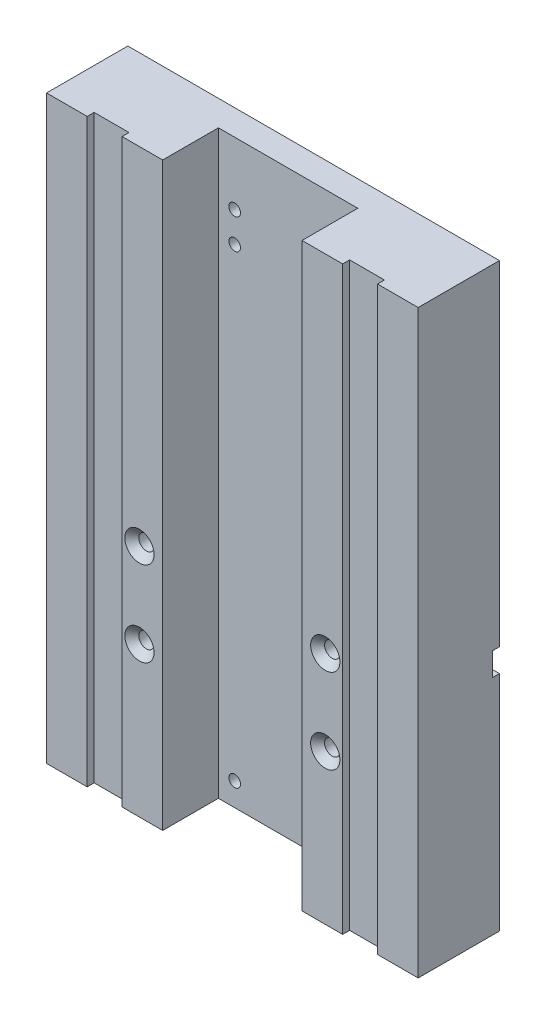
ISO-10303-21;
HEADER;
FILE_DESCRIPTION(('STEP AP214'),'2;1');
FILE_NAME('part.step','',(''),(''),'','','');
FILE_SCHEMA(('AUTOMOTIVE_DESIGN { 1 0 10303 214 1 1 1 1 }'));
ENDSEC;
DATA;
#1=APPLICATION_CONTEXT('core data for automotive mechanical design processes');
#2=APPLICATION_PROTOCOL_DEFINITION('international standard','automotive_design',2000,#1);
#3=PRODUCT_CONTEXT('',#1,'mechanical');
#4=PRODUCT('Part','Part','',(#3));
#5=PRODUCT_RELATED_PRODUCT_CATEGORY('part','',(#4));
#6=PRODUCT_DEFINITION_FORMATION('','',#4);
#7=PRODUCT_DEFINITION_CONTEXT('part definition',#1,'design');
#8=PRODUCT_DEFINITION('design','',#6,#7);
#9=PRODUCT_DEFINITION_SHAPE('','',#8);
#10=(LENGTH_UNIT() NAMED_UNIT(*) SI_UNIT(.MILLI.,.METRE.));
#11=(NAMED_UNIT(*) PLANE_ANGLE_UNIT() SI_UNIT($,.RADIAN.));
#12=(NAMED_UNIT(*) SI_UNIT($,.STERADIAN.) SOLID_ANGLE_UNIT());
#13=UNCERTAINTY_MEASURE_WITH_UNIT(LENGTH_MEASURE(1.E-05),#10,'distance_accuracy_value','');
#14=(GEOMETRIC_REPRESENTATION_CONTEXT(3) GLOBAL_UNCERTAINTY_ASSIGNED_CONTEXT((#13)) GLOBAL_UNIT_ASSIGNED_CONTEXT((#10,
#11,#12)) REPRESENTATION_CONTEXT('',''));
#15=CARTESIAN_POINT('',(0.,0.,0.));
#16=DIRECTION('',(0.,0.,1.));
#17=DIRECTION('',(1.,0.,0.));
#18=AXIS2_PLACEMENT_3D('',#15,#16,#17);
#19=CARTESIAN_POINT('',(0.,0.,0.));
#20=DIRECTION('',(0.,0.,-1.));
#21=DIRECTION('',(-1.,0.,0.));
#22=AXIS2_PLACEMENT_3D('',#19,#20,#21);
#23=PLANE('',#22);
#24=DIRECTION('',(1.,0.,0.));
#25=VECTOR('',#24,1.);
#26=CARTESIAN_POINT('',(80.,202.,0.));
#27=LINE('',#26,#25);
#28=CARTESIAN_POINT('',(62.5,202.,0.));
#29=VERTEX_POINT('',#28);
#30=CARTESIAN_POINT('',(80.,202.,0.));
#31=VERTEX_POINT('',#30);
#32=EDGE_CURVE('E338',#29,#31,#27,.T.);
#33=ORIENTED_EDGE('',*,*,#32,.F.);
#34=DIRECTION('',(0.,1.,0.));
#35=VECTOR('',#34,1.);
#36=CARTESIAN_POINT('',(62.5,252.,0.));
#37=LINE('',#36,#35);
#38=CARTESIAN_POINT('',(62.5,-48.,0.));
#39=VERTEX_POINT('',#38);
#40=EDGE_CURVE('E209',#39,#29,#37,.T.);
#41=ORIENTED_EDGE('',*,*,#40,.F.);
#42=DIRECTION('',(-1.,0.,0.));
#43=VECTOR('',#42,1.);
#44=CARTESIAN_POINT('',(80.,-48.,0.));
#45=LINE('',#44,#43);
#46=CARTESIAN_POINT('',(80.,-48.,0.));
#47=VERTEX_POINT('',#46);
#48=EDGE_CURVE('E331',#47,#39,#45,.T.);
#49=ORIENTED_EDGE('',*,*,#48,.F.);
#50=DIRECTION('',(0.,-1.,0.));
#51=VECTOR('',#50,1.);
#52=CARTESIAN_POINT('',(80.,202.,0.));
#53=LINE('',#52,#51);
#54=EDGE_CURVE('E308',#31,#47,#53,.T.);
#55=ORIENTED_EDGE('',*,*,#54,.F.);
#56=EDGE_LOOP('',(#33,#41,#49,#55));
#57=FACE_BOUND('',#56,.T.);
#58=ADVANCED_FACE('F38',(#57),#23,.F.);
#59=CARTESIAN_POINT('',(-62.5,-48.,0.));
#60=VERTEX_POINT('',#59);
#61=CARTESIAN_POINT('',(-80.,-48.,0.));
#62=VERTEX_POINT('',#61);
#63=EDGE_CURVE('E330',#60,#62,#45,.T.);
#64=ORIENTED_EDGE('',*,*,#63,.F.);
#65=DIRECTION('',(0.,1.,0.));
#66=VECTOR('',#65,1.);
#67=CARTESIAN_POINT('',(-62.5,0.,0.));
#68=LINE('',#67,#66);
#69=CARTESIAN_POINT('',(-62.5,202.,0.));
#70=VERTEX_POINT('',#69);
#71=EDGE_CURVE('E190',#60,#70,#68,.T.);
#72=ORIENTED_EDGE('',*,*,#71,.T.);
#73=CARTESIAN_POINT('',(-80.,202.,0.));
#74=VERTEX_POINT('',#73);
#75=EDGE_CURVE('E339',#74,#70,#27,.T.);
#76=ORIENTED_EDGE('',*,*,#75,.F.);
#77=DIRECTION('',(0.,1.,0.));
#78=VECTOR('',#77,1.);
#79=CARTESIAN_POINT('',(-80.,202.,0.));
#80=LINE('',#79,#78);
#81=EDGE_CURVE('E334',#62,#74,#80,.T.);
#82=ORIENTED_EDGE('',*,*,#81,.F.);
#83=EDGE_LOOP('',(#64,#72,#76,#82));
#84=FACE_BOUND('',#83,.T.);
#85=ADVANCED_FACE('F398',(#84),#23,.F.);
#86=CARTESIAN_POINT('',(80.,-48.,-35.));
#87=DIRECTION('',(0.,1.,0.));
#88=DIRECTION('',(0.,0.,1.));
#89=AXIS2_PLACEMENT_3D('',#86,#87,#88);
#90=PLANE('',#89);
#91=DIRECTION('',(1.,0.,0.));
#92=VECTOR('',#91,1.);
#93=CARTESIAN_POINT('',(-62.5,-48.,-3.));
#94=LINE('',#93,#92);
#95=CARTESIAN_POINT('',(-62.5,-48.,-3.));
#96=VERTEX_POINT('',#95);
#97=CARTESIAN_POINT('',(-47.5,-48.,-3.));
#98=VERTEX_POINT('',#97);
#99=EDGE_CURVE('E180',#96,#98,#94,.T.);
#100=ORIENTED_EDGE('',*,*,#99,.F.);
#101=DIRECTION('',(0.,0.,1.));
#102=VECTOR('',#101,1.);
#103=CARTESIAN_POINT('',(-62.5,-48.,-3.));
#104=LINE('',#103,#102);
#105=EDGE_CURVE('E187',#96,#60,#104,.T.);
#106=ORIENTED_EDGE('',*,*,#105,.T.);
#107=ORIENTED_EDGE('',*,*,#63,.T.);
#108=DIRECTION('',(0.,0.,1.));
#109=VECTOR('',#108,1.);
#110=CARTESIAN_POINT('',(-80.,-48.,-35.));
#111=LINE('',#110,#109);
#112=CARTESIAN_POINT('',(-80.,-48.,-35.));
#113=VERTEX_POINT('',#112);
#114=EDGE_CURVE('E349',#113,#62,#111,.T.);
#115=ORIENTED_EDGE('',*,*,#114,.F.);
#116=DIRECTION('',(-1.,0.,0.));
#117=VECTOR('',#116,1.);
#118=CARTESIAN_POINT('',(80.,-48.,-35.));
#119=LINE('',#118,#117);
#120=CARTESIAN_POINT('',(80.,-48.,-35.));
#121=VERTEX_POINT('',#120);
#122=EDGE_CURVE('E318',#121,#113,#119,.T.);
#123=ORIENTED_EDGE('',*,*,#122,.F.);
#124=DIRECTION('',(0.,0.,1.));
#125=VECTOR('',#124,1.);
#126=CARTESIAN_POINT('',(80.,-48.,-35.));
#127=LINE('',#126,#125);
#128=EDGE_CURVE('E352',#121,#47,#127,.T.);
#129=ORIENTED_EDGE('',*,*,#128,.T.);
#130=ORIENTED_EDGE('',*,*,#48,.T.);
#131=DIRECTION('',(0.,0.,1.));
#132=VECTOR('',#131,1.);
#133=CARTESIAN_POINT('',(62.5,-48.,-3.));
#134=LINE('',#133,#132);
#135=CARTESIAN_POINT('',(62.5,-48.,-3.));
#136=VERTEX_POINT('',#135);
#137=EDGE_CURVE('E202',#136,#39,#134,.T.);
#138=ORIENTED_EDGE('',*,*,#137,.F.);
#139=DIRECTION('',(1.,0.,0.));
#140=VECTOR('',#139,1.);
#141=CARTESIAN_POINT('',(62.5,-48.,-3.));
#142=LINE('',#141,#140);
#143=CARTESIAN_POINT('',(47.5,-48.,-3.));
#144=VERTEX_POINT('',#143);
#145=EDGE_CURVE('E211',#144,#136,#142,.T.);
#146=ORIENTED_EDGE('',*,*,#145,.F.);
#147=DIRECTION('',(0.,0.,1.));
#148=VECTOR('',#147,1.);
#149=CARTESIAN_POINT('',(47.5,-48.,-3.));
#150=LINE('',#149,#148);
#151=CARTESIAN_POINT('',(47.5,-48.,0.));
#152=VERTEX_POINT('',#151);
#153=EDGE_CURVE('E214',#144,#152,#150,.T.);
#154=ORIENTED_EDGE('',*,*,#153,.T.);
#155=CARTESIAN_POINT('',(30.,-48.,0.));
#156=VERTEX_POINT('',#155);
#157=EDGE_CURVE('E335',#152,#156,#45,.T.);
#158=ORIENTED_EDGE('',*,*,#157,.T.);
#159=DIRECTION('',(0.,0.,1.));
#160=VECTOR('',#159,1.);
#161=CARTESIAN_POINT('',(30.,-48.,-24.));
#162=LINE('',#161,#160);
#163=CARTESIAN_POINT('',(30.,-48.,-24.));
#164=VERTEX_POINT('',#163);
#165=EDGE_CURVE('E254',#164,#156,#162,.T.);
#166=ORIENTED_EDGE('',*,*,#165,.F.);
#167=DIRECTION('',(-1.,0.,0.));
#168=VECTOR('',#167,1.);
#169=CARTESIAN_POINT('',(30.,-48.,-24.));
#170=LINE('',#169,#168);
#171=CARTESIAN_POINT('',(-30.,-48.,-24.));
#172=VERTEX_POINT('',#171);
#173=EDGE_CURVE('E232',#164,#172,#170,.T.);
#174=ORIENTED_EDGE('',*,*,#173,.T.);
#175=DIRECTION('',(0.,0.,1.));
#176=VECTOR('',#175,1.);
#177=CARTESIAN_POINT('',(-30.,-48.,-24.));
#178=LINE('',#177,#176);
#179=CARTESIAN_POINT('',(-30.,-48.,0.));
#180=VERTEX_POINT('',#179);
#181=EDGE_CURVE('E251',#172,#180,#178,.T.);
#182=ORIENTED_EDGE('',*,*,#181,.T.);
#183=CARTESIAN_POINT('',(-47.5,-48.,0.));
#184=VERTEX_POINT('',#183);
#185=EDGE_CURVE('E336',#180,#184,#45,.T.);
#186=ORIENTED_EDGE('',*,*,#185,.T.);
#187=DIRECTION('',(0.,0.,1.));
#188=VECTOR('',#187,1.);
#189=CARTESIAN_POINT('',(-47.5,-48.,-3.));
#190=LINE('',#189,#188);
#191=EDGE_CURVE('E61',#98,#184,#190,.T.);
#192=ORIENTED_EDGE('',*,*,#191,.F.);
#193=EDGE_LOOP('',(#100,#106,#107,#115,#123,#129,#130,#138,#146,#154,#158,#166,#174,#182,#186,#192));
#194=FACE_BOUND('',#193,.T.);
#195=ADVANCED_FACE('F195',(#194),#90,.F.);
#196=CARTESIAN_POINT('',(80.,202.,-35.));
#197=DIRECTION('',(0.,-1.,0.));
#198=DIRECTION('',(0.,0.,-1.));
#199=AXIS2_PLACEMENT_3D('',#196,#197,#198);
#200=PLANE('',#199);
#201=ORIENTED_EDGE('',*,*,#75,.T.);
#202=DIRECTION('',(0.,0.,-1.));
#203=VECTOR('',#202,1.);
#204=CARTESIAN_POINT('',(-62.5,202.,-35.));
#205=LINE('',#204,#203);
#206=CARTESIAN_POINT('',(-62.5,202.,-3.));
#207=VERTEX_POINT('',#206);
#208=EDGE_CURVE('E222',#70,#207,#205,.T.);
#209=ORIENTED_EDGE('',*,*,#208,.T.);
#210=DIRECTION('',(-1.,0.,0.));
#211=VECTOR('',#210,1.);
#212=CARTESIAN_POINT('',(80.,202.,-3.));
#213=LINE('',#212,#211);
#214=CARTESIAN_POINT('',(-47.5,202.,-3.));
#215=VERTEX_POINT('',#214);
#216=EDGE_CURVE('E11',#215,#207,#213,.T.);
#217=ORIENTED_EDGE('',*,*,#216,.F.);
#218=DIRECTION('',(0.,0.,1.));
#219=VECTOR('',#218,1.);
#220=CARTESIAN_POINT('',(-47.5,202.,-35.));
#221=LINE('',#220,#219);
#222=CARTESIAN_POINT('',(-47.5,202.,0.));
#223=VERTEX_POINT('',#222);
#224=EDGE_CURVE('E203',#215,#223,#221,.T.);
#225=ORIENTED_EDGE('',*,*,#224,.T.);
#226=CARTESIAN_POINT('',(-30.,202.,0.));
#227=VERTEX_POINT('',#226);
#228=EDGE_CURVE('E342',#223,#227,#27,.T.);
#229=ORIENTED_EDGE('',*,*,#228,.T.);
#230=DIRECTION('',(0.,0.,1.));
#231=VECTOR('',#230,1.);
#232=CARTESIAN_POINT('',(-30.,202.,-24.));
#233=LINE('',#232,#231);
#234=CARTESIAN_POINT('',(-30.,202.,-24.));
#235=VERTEX_POINT('',#234);
#236=EDGE_CURVE('E248',#235,#227,#233,.T.);
#237=ORIENTED_EDGE('',*,*,#236,.F.);
#238=DIRECTION('',(1.,0.,0.));
#239=VECTOR('',#238,1.);
#240=CARTESIAN_POINT('',(30.,202.,-24.));
#241=LINE('',#240,#239);
#242=CARTESIAN_POINT('',(30.,202.,-24.));
#243=VERTEX_POINT('',#242);
#244=EDGE_CURVE('E238',#235,#243,#241,.T.);
#245=ORIENTED_EDGE('',*,*,#244,.T.);
#246=DIRECTION('',(0.,0.,1.));
#247=VECTOR('',#246,1.);
#248=CARTESIAN_POINT('',(30.,202.,-24.));
#249=LINE('',#248,#247);
#250=CARTESIAN_POINT('',(30.,202.,0.));
#251=VERTEX_POINT('',#250);
#252=EDGE_CURVE('E241',#243,#251,#249,.T.);
#253=ORIENTED_EDGE('',*,*,#252,.T.);
#254=CARTESIAN_POINT('',(47.5,202.,0.));
#255=VERTEX_POINT('',#254);
#256=EDGE_CURVE('E343',#251,#255,#27,.T.);
#257=ORIENTED_EDGE('',*,*,#256,.T.);
#258=DIRECTION('',(0.,0.,-1.));
#259=VECTOR('',#258,1.);
#260=CARTESIAN_POINT('',(47.5,202.,-35.));
#261=LINE('',#260,#259);
#262=CARTESIAN_POINT('',(47.5,202.,-3.));
#263=VERTEX_POINT('',#262);
#264=EDGE_CURVE('E53',#255,#263,#261,.T.);
#265=ORIENTED_EDGE('',*,*,#264,.T.);
#266=DIRECTION('',(1.,0.,0.));
#267=VECTOR('',#266,1.);
#268=CARTESIAN_POINT('',(80.,202.,-3.));
#269=LINE('',#268,#267);
#270=CARTESIAN_POINT('',(62.5,202.,-3.));
#271=VERTEX_POINT('',#270);
#272=EDGE_CURVE('E46',#263,#271,#269,.T.);
#273=ORIENTED_EDGE('',*,*,#272,.T.);
#274=DIRECTION('',(0.,0.,1.));
#275=VECTOR('',#274,1.);
#276=CARTESIAN_POINT('',(62.5,202.,-35.));
#277=LINE('',#276,#275);
#278=EDGE_CURVE('E225',#271,#29,#277,.T.);
#279=ORIENTED_EDGE('',*,*,#278,.T.);
#280=ORIENTED_EDGE('',*,*,#32,.T.);
#281=DIRECTION('',(0.,0.,1.));
#282=VECTOR('',#281,1.);
#283=CARTESIAN_POINT('',(80.,202.,-35.));
#284=LINE('',#283,#282);
#285=CARTESIAN_POINT('',(80.,202.,-35.));
#286=VERTEX_POINT('',#285);
#287=EDGE_CURVE('E327',#286,#31,#284,.T.);
#288=ORIENTED_EDGE('',*,*,#287,.F.);
#289=DIRECTION('',(1.,0.,0.));
#290=VECTOR('',#289,1.);
#291=CARTESIAN_POINT('',(80.,202.,-35.));
#292=LINE('',#291,#290);
#293=CARTESIAN_POINT('',(-80.,202.,-35.));
#294=VERTEX_POINT('',#293);
#295=EDGE_CURVE('E325',#294,#286,#292,.T.);
#296=ORIENTED_EDGE('',*,*,#295,.F.);
#297=DIRECTION('',(0.,0.,1.));
#298=VECTOR('',#297,1.);
#299=CARTESIAN_POINT('',(-80.,202.,-35.));
#300=LINE('',#299,#298);
#301=EDGE_CURVE('E346',#294,#74,#300,.T.);
#302=ORIENTED_EDGE('',*,*,#301,.T.);
#303=EDGE_LOOP('',(#201,#209,#217,#225,#229,#237,#245,#253,#257,#265,#273,#279,#280,#288,#296,#302));
#304=FACE_BOUND('',#303,.T.);
#305=ADVANCED_FACE('F363',(#304),#200,.F.);
#306=CARTESIAN_POINT('',(40.,16.5,0.));
#307=DIRECTION('',(0.,0.,1.));
#308=DIRECTION('',(1.,0.,0.));
#309=AXIS2_PLACEMENT_3D('',#306,#307,#308);
#310=CIRCLE('',#309,6.3);
#311=CARTESIAN_POINT('',(46.3,16.5,0.));
#312=VERTEX_POINT('',#311);
#313=EDGE_CURVE('E280',#312,#312,#310,.T.);
#314=ORIENTED_EDGE('',*,*,#313,.F.);
#315=EDGE_LOOP('',(#314));
#316=FACE_BOUND('',#315,.T.);
#317=CARTESIAN_POINT('',(40.,53.,0.));
#318=DIRECTION('',(0.,0.,1.));
#319=DIRECTION('',(1.,0.,0.));
#320=AXIS2_PLACEMENT_3D('',#317,#318,#319);
#321=CIRCLE('',#320,6.3);
#322=CARTESIAN_POINT('',(46.3,53.,0.));
#323=VERTEX_POINT('',#322);
#324=EDGE_CURVE('E264',#323,#323,#321,.T.);
#325=ORIENTED_EDGE('',*,*,#324,.F.);
#326=EDGE_LOOP('',(#325));
#327=FACE_BOUND('',#326,.T.);
#328=ORIENTED_EDGE('',*,*,#157,.F.);
#329=DIRECTION('',(0.,1.,0.));
#330=VECTOR('',#329,1.);
#331=CARTESIAN_POINT('',(47.5,0.,0.));
#332=LINE('',#331,#330);
#333=EDGE_CURVE('E360',#152,#255,#332,.T.);
#334=ORIENTED_EDGE('',*,*,#333,.T.);
#335=ORIENTED_EDGE('',*,*,#256,.F.);
#336=DIRECTION('',(0.,-1.,0.));
#337=VECTOR('',#336,1.);
#338=CARTESIAN_POINT('',(30.,202.,0.));
#339=LINE('',#338,#337);
#340=EDGE_CURVE('E228',#251,#156,#339,.T.);
#341=ORIENTED_EDGE('',*,*,#340,.T.);
#342=EDGE_LOOP('',(#328,#334,#335,#341));
#343=FACE_BOUND('',#342,.T.);
#344=ADVANCED_FACE('F434',(#316,#327,#343),#23,.F.);
#345=CARTESIAN_POINT('',(-40.,16.5,0.));
#346=DIRECTION('',(0.,0.,1.));
#347=DIRECTION('',(1.,0.,0.));
#348=AXIS2_PLACEMENT_3D('',#345,#346,#347);
#349=CIRCLE('',#348,6.3);
#350=CARTESIAN_POINT('',(-33.7,16.5,0.));
#351=VERTEX_POINT('',#350);
#352=EDGE_CURVE('E271',#351,#351,#349,.T.);
#353=ORIENTED_EDGE('',*,*,#352,.F.);
#354=EDGE_LOOP('',(#353));
#355=FACE_BOUND('',#354,.T.);
#356=CARTESIAN_POINT('',(-40.,53.,0.));
#357=DIRECTION('',(0.,0.,1.));
#358=DIRECTION('',(1.,0.,0.));
#359=AXIS2_PLACEMENT_3D('',#356,#357,#358);
#360=CIRCLE('',#359,6.3);
#361=CARTESIAN_POINT('',(-33.7,53.,0.));
#362=VERTEX_POINT('',#361);
#363=EDGE_CURVE('E257',#362,#362,#360,.T.);
#364=ORIENTED_EDGE('',*,*,#363,.F.);
#365=EDGE_LOOP('',(#364));
#366=FACE_BOUND('',#365,.T.);
#367=ORIENTED_EDGE('',*,*,#228,.F.);
#368=DIRECTION('',(0.,1.,0.));
#369=VECTOR('',#368,1.);
#370=CARTESIAN_POINT('',(-47.5,252.,0.));
#371=LINE('',#370,#369);
#372=EDGE_CURVE('E184',#184,#223,#371,.T.);
#373=ORIENTED_EDGE('',*,*,#372,.F.);
#374=ORIENTED_EDGE('',*,*,#185,.F.);
#375=DIRECTION('',(0.,1.,0.));
#376=VECTOR('',#375,1.);
#377=CARTESIAN_POINT('',(-30.,202.,0.));
#378=LINE('',#377,#376);
#379=EDGE_CURVE('E233',#180,#227,#378,.T.);
#380=ORIENTED_EDGE('',*,*,#379,.T.);
#381=EDGE_LOOP('',(#367,#373,#374,#380));
#382=FACE_BOUND('',#381,.T.);
#383=ADVANCED_FACE('F387',(#355,#366,#382),#23,.F.);
#384=CARTESIAN_POINT('',(0.,0.,-35.));
#385=DIRECTION('',(0.,0.,-1.));
#386=DIRECTION('',(-1.,0.,0.));
#387=AXIS2_PLACEMENT_3D('',#384,#385,#386);
#388=PLANE('',#387);
#389=CARTESIAN_POINT('',(-23.,162.,-35.));
#390=DIRECTION('',(0.,0.,1.));
#391=DIRECTION('',(1.,0.,0.));
#392=AXIS2_PLACEMENT_3D('',#389,#390,#391);
#393=CIRCLE('',#392,2.5);
#394=CARTESIAN_POINT('',(-20.5,162.,-35.));
#395=VERTEX_POINT('',#394);
#396=EDGE_CURVE('E526',#395,#395,#393,.T.);
#397=ORIENTED_EDGE('',*,*,#396,.T.);
#398=EDGE_LOOP('',(#397));
#399=FACE_BOUND('',#398,.T.);
#400=CARTESIAN_POINT('',(23.,162.,-35.));
#401=DIRECTION('',(0.,0.,1.));
#402=DIRECTION('',(1.,0.,0.));
#403=AXIS2_PLACEMENT_3D('',#400,#401,#402);
#404=CIRCLE('',#403,2.5);
#405=CARTESIAN_POINT('',(25.5,162.,-35.));
#406=VERTEX_POINT('',#405);
#407=EDGE_CURVE('E530',#406,#406,#404,.T.);
#408=ORIENTED_EDGE('',*,*,#407,.T.);
#409=EDGE_LOOP('',(#408));
#410=FACE_BOUND('',#409,.T.);
#411=CARTESIAN_POINT('',(-23.,175.,-35.));
#412=DIRECTION('',(0.,0.,1.));
#413=DIRECTION('',(1.,0.,0.));
#414=AXIS2_PLACEMENT_3D('',#411,#412,#413);
#415=CIRCLE('',#414,2.5);
#416=CARTESIAN_POINT('',(-20.5,175.,-35.));
#417=VERTEX_POINT('',#416);
#418=EDGE_CURVE('E534',#417,#417,#415,.T.);
#419=ORIENTED_EDGE('',*,*,#418,.T.);
#420=EDGE_LOOP('',(#419));
#421=FACE_BOUND('',#420,.T.);
#422=CARTESIAN_POINT('',(23.,175.,-35.));
#423=DIRECTION('',(0.,0.,1.));
#424=DIRECTION('',(1.,0.,0.));
#425=AXIS2_PLACEMENT_3D('',#422,#423,#424);
#426=CIRCLE('',#425,2.5);
#427=CARTESIAN_POINT('',(25.5,175.,-35.));
#428=VERTEX_POINT('',#427);
#429=EDGE_CURVE('E537',#428,#428,#426,.T.);
#430=ORIENTED_EDGE('',*,*,#429,.T.);
#431=EDGE_LOOP('',(#430));
#432=FACE_BOUND('',#431,.T.);
#433=DIRECTION('',(1.,0.,0.));
#434=VECTOR('',#433,1.);
#435=CARTESIAN_POINT('',(80.,58.,-35.));
#436=LINE('',#435,#434);
#437=CARTESIAN_POINT('',(-80.,58.,-35.));
#438=VERTEX_POINT('',#437);
#439=CARTESIAN_POINT('',(80.,58.,-35.));
#440=VERTEX_POINT('',#439);
#441=EDGE_CURVE('E294',#438,#440,#436,.T.);
#442=ORIENTED_EDGE('',*,*,#441,.F.);
#443=DIRECTION('',(0.,1.,0.));
#444=VECTOR('',#443,1.);
#445=CARTESIAN_POINT('',(-80.,202.,-35.));
#446=LINE('',#445,#444);
#447=EDGE_CURVE('E321',#438,#294,#446,.T.);
#448=ORIENTED_EDGE('',*,*,#447,.T.);
#449=ORIENTED_EDGE('',*,*,#295,.T.);
#450=DIRECTION('',(0.,-1.,0.));
#451=VECTOR('',#450,1.);
#452=CARTESIAN_POINT('',(80.,202.,-35.));
#453=LINE('',#452,#451);
#454=EDGE_CURVE('E315',#286,#440,#453,.T.);
#455=ORIENTED_EDGE('',*,*,#454,.T.);
#456=EDGE_LOOP('',(#442,#448,#449,#455));
#457=FACE_BOUND('',#456,.T.);
#458=ADVANCED_FACE('F404',(#399,#410,#421,#432,#457),#388,.T.);
#459=CARTESIAN_POINT('',(80.,202.,-35.));
#460=DIRECTION('',(-1.,0.,0.));
#461=DIRECTION('',(0.,-1.,0.));
#462=AXIS2_PLACEMENT_3D('',#459,#460,#461);
#463=PLANE('',#462);
#464=DIRECTION('',(0.,-1.,0.));
#465=VECTOR('',#464,1.);
#466=CARTESIAN_POINT('',(80.,58.,-32.));
#467=LINE('',#466,#465);
#468=CARTESIAN_POINT('',(80.,58.,-32.));
#469=VERTEX_POINT('',#468);
#470=CARTESIAN_POINT('',(80.,48.,-32.));
#471=VERTEX_POINT('',#470);
#472=EDGE_CURVE('E290',#469,#471,#467,.T.);
#473=ORIENTED_EDGE('',*,*,#472,.F.);
#474=DIRECTION('',(0.,0.,-1.));
#475=VECTOR('',#474,1.);
#476=CARTESIAN_POINT('',(80.,58.,-32.));
#477=LINE('',#476,#475);
#478=EDGE_CURVE('E305',#469,#440,#477,.T.);
#479=ORIENTED_EDGE('',*,*,#478,.T.);
#480=ORIENTED_EDGE('',*,*,#454,.F.);
#481=ORIENTED_EDGE('',*,*,#287,.T.);
#482=ORIENTED_EDGE('',*,*,#54,.T.);
#483=ORIENTED_EDGE('',*,*,#128,.F.);
#484=CARTESIAN_POINT('',(80.,48.,-35.));
#485=VERTEX_POINT('',#484);
#486=EDGE_CURVE('E319',#485,#121,#453,.T.);
#487=ORIENTED_EDGE('',*,*,#486,.F.);
#488=DIRECTION('',(0.,0.,-1.));
#489=VECTOR('',#488,1.);
#490=CARTESIAN_POINT('',(80.,48.,-32.));
#491=LINE('',#490,#489);
#492=EDGE_CURVE('E302',#471,#485,#491,.T.);
#493=ORIENTED_EDGE('',*,*,#492,.F.);
#494=EDGE_LOOP('',(#473,#479,#480,#481,#482,#483,#487,#493));
#495=FACE_BOUND('',#494,.T.);
#496=ADVANCED_FACE('F40',(#495),#463,.F.);
#497=CARTESIAN_POINT('',(-80.,202.,-35.));
#498=DIRECTION('',(1.,0.,0.));
#499=DIRECTION('',(0.,1.,0.));
#500=AXIS2_PLACEMENT_3D('',#497,#498,#499);
#501=PLANE('',#500);
#502=ORIENTED_EDGE('',*,*,#447,.F.);
#503=DIRECTION('',(0.,0.,-1.));
#504=VECTOR('',#503,1.);
#505=CARTESIAN_POINT('',(-80.,58.,-32.));
#506=LINE('',#505,#504);
#507=CARTESIAN_POINT('',(-80.,58.,-32.));
#508=VERTEX_POINT('',#507);
#509=EDGE_CURVE('E309',#508,#438,#506,.T.);
#510=ORIENTED_EDGE('',*,*,#509,.F.);
#511=DIRECTION('',(0.,1.,0.));
#512=VECTOR('',#511,1.);
#513=CARTESIAN_POINT('',(-80.,58.,-32.));
#514=LINE('',#513,#512);
#515=CARTESIAN_POINT('',(-80.,48.,-32.));
#516=VERTEX_POINT('',#515);
#517=EDGE_CURVE('E297',#516,#508,#514,.T.);
#518=ORIENTED_EDGE('',*,*,#517,.F.);
#519=DIRECTION('',(0.,0.,-1.));
#520=VECTOR('',#519,1.);
#521=CARTESIAN_POINT('',(-80.,48.,-32.));
#522=LINE('',#521,#520);
#523=CARTESIAN_POINT('',(-80.,48.,-35.));
#524=VERTEX_POINT('',#523);
#525=EDGE_CURVE('E311',#516,#524,#522,.T.);
#526=ORIENTED_EDGE('',*,*,#525,.T.);
#527=EDGE_CURVE('E322',#113,#524,#446,.T.);
#528=ORIENTED_EDGE('',*,*,#527,.F.);
#529=ORIENTED_EDGE('',*,*,#114,.T.);
#530=ORIENTED_EDGE('',*,*,#81,.T.);
#531=ORIENTED_EDGE('',*,*,#301,.F.);
#532=EDGE_LOOP('',(#502,#510,#518,#526,#528,#529,#530,#531));
#533=FACE_BOUND('',#532,.T.);
#534=ADVANCED_FACE('F395',(#533),#501,.F.);
#535=CARTESIAN_POINT('',(-23.,-38.,-35.));
#536=DIRECTION('',(0.,0.,1.));
#537=DIRECTION('',(1.,0.,0.));
#538=AXIS2_PLACEMENT_3D('',#535,#536,#537);
#539=CIRCLE('',#538,2.5);
#540=CARTESIAN_POINT('',(-20.5,-38.,-35.));
#541=VERTEX_POINT('',#540);
#542=EDGE_CURVE('E543',#541,#541,#539,.T.);
#543=ORIENTED_EDGE('',*,*,#542,.T.);
#544=EDGE_LOOP('',(#543));
#545=FACE_BOUND('',#544,.T.);
#546=CARTESIAN_POINT('',(23.,-38.,-35.));
#547=DIRECTION('',(0.,0.,1.));
#548=DIRECTION('',(1.,0.,0.));
#549=AXIS2_PLACEMENT_3D('',#546,#547,#548);
#550=CIRCLE('',#549,2.5);
#551=CARTESIAN_POINT('',(25.5,-38.,-35.));
#552=VERTEX_POINT('',#551);
#553=EDGE_CURVE('E216',#552,#552,#550,.T.);
#554=ORIENTED_EDGE('',*,*,#553,.T.);
#555=EDGE_LOOP('',(#554));
#556=FACE_BOUND('',#555,.T.);
#557=CARTESIAN_POINT('',(-40.,16.5,-35.));
#558=DIRECTION('',(0.,0.,1.));
#559=DIRECTION('',(1.,0.,0.));
#560=AXIS2_PLACEMENT_3D('',#557,#558,#559);
#561=CIRCLE('',#560,3.29999999999999);
#562=CARTESIAN_POINT('',(-36.7,16.5,-35.));
#563=VERTEX_POINT('',#562);
#564=EDGE_CURVE('E277',#563,#563,#561,.T.);
#565=ORIENTED_EDGE('',*,*,#564,.T.);
#566=EDGE_LOOP('',(#565));
#567=FACE_BOUND('',#566,.T.);
#568=CARTESIAN_POINT('',(40.,16.5,-35.));
#569=DIRECTION('',(0.,0.,1.));
#570=DIRECTION('',(1.,0.,0.));
#571=AXIS2_PLACEMENT_3D('',#568,#569,#570);
#572=CIRCLE('',#571,3.29999999999999);
#573=CARTESIAN_POINT('',(43.3,16.5,-35.));
#574=VERTEX_POINT('',#573);
#575=EDGE_CURVE('E286',#574,#574,#572,.T.);
#576=ORIENTED_EDGE('',*,*,#575,.T.);
#577=EDGE_LOOP('',(#576));
#578=FACE_BOUND('',#577,.T.);
#579=DIRECTION('',(-1.,0.,0.));
#580=VECTOR('',#579,1.);
#581=CARTESIAN_POINT('',(80.,48.,-35.));
#582=LINE('',#581,#580);
#583=EDGE_CURVE('E289',#485,#524,#582,.T.);
#584=ORIENTED_EDGE('',*,*,#583,.F.);
#585=ORIENTED_EDGE('',*,*,#486,.T.);
#586=ORIENTED_EDGE('',*,*,#122,.T.);
#587=ORIENTED_EDGE('',*,*,#527,.T.);
#588=EDGE_LOOP('',(#584,#585,#586,#587));
#589=FACE_BOUND('',#588,.T.);
#590=ADVANCED_FACE('F418',(#545,#556,#567,#578,#589),#388,.T.);
#591=CARTESIAN_POINT('',(80.,58.,-32.));
#592=DIRECTION('',(0.,1.,0.));
#593=DIRECTION('',(0.,0.,1.));
#594=AXIS2_PLACEMENT_3D('',#591,#592,#593);
#595=PLANE('',#594);
#596=ORIENTED_EDGE('',*,*,#441,.T.);
#597=ORIENTED_EDGE('',*,*,#478,.F.);
#598=DIRECTION('',(1.,0.,0.));
#599=VECTOR('',#598,1.);
#600=CARTESIAN_POINT('',(80.,58.,-32.));
#601=LINE('',#600,#599);
#602=EDGE_CURVE('E299',#508,#469,#601,.T.);
#603=ORIENTED_EDGE('',*,*,#602,.F.);
#604=ORIENTED_EDGE('',*,*,#509,.T.);
#605=EDGE_LOOP('',(#596,#597,#603,#604));
#606=FACE_BOUND('',#605,.T.);
#607=ADVANCED_FACE('F407',(#606),#595,.F.);
#608=CARTESIAN_POINT('',(80.,48.,-32.));
#609=DIRECTION('',(0.,-1.,0.));
#610=DIRECTION('',(0.,0.,-1.));
#611=AXIS2_PLACEMENT_3D('',#608,#609,#610);
#612=PLANE('',#611);
#613=ORIENTED_EDGE('',*,*,#583,.T.);
#614=ORIENTED_EDGE('',*,*,#525,.F.);
#615=DIRECTION('',(-1.,0.,0.));
#616=VECTOR('',#615,1.);
#617=CARTESIAN_POINT('',(80.,48.,-32.));
#618=LINE('',#617,#616);
#619=EDGE_CURVE('E293',#471,#516,#618,.T.);
#620=ORIENTED_EDGE('',*,*,#619,.F.);
#621=ORIENTED_EDGE('',*,*,#492,.T.);
#622=EDGE_LOOP('',(#613,#614,#620,#621));
#623=FACE_BOUND('',#622,.T.);
#624=ADVANCED_FACE('F420',(#623),#612,.F.);
#625=CARTESIAN_POINT('',(0.,0.,-32.));
#626=DIRECTION('',(0.,0.,-1.));
#627=DIRECTION('',(-1.,0.,0.));
#628=AXIS2_PLACEMENT_3D('',#625,#626,#627);
#629=PLANE('',#628);
#630=CARTESIAN_POINT('',(-40.,53.,-32.));
#631=DIRECTION('',(0.,0.,-1.));
#632=DIRECTION('',(-1.,0.,0.));
#633=AXIS2_PLACEMENT_3D('',#630,#631,#632);
#634=CIRCLE('',#633,3.29999999999999);
#635=CARTESIAN_POINT('',(-43.3,53.,-32.));
#636=VERTEX_POINT('',#635);
#637=EDGE_CURVE('E263',#636,#636,#634,.T.);
#638=ORIENTED_EDGE('',*,*,#637,.F.);
#639=EDGE_LOOP('',(#638));
#640=FACE_BOUND('',#639,.T.);
#641=CARTESIAN_POINT('',(40.,53.,-32.));
#642=DIRECTION('',(0.,0.,-1.));
#643=DIRECTION('',(-1.,0.,0.));
#644=AXIS2_PLACEMENT_3D('',#641,#642,#643);
#645=CIRCLE('',#644,3.29999999999999);
#646=CARTESIAN_POINT('',(36.7,53.,-32.));
#647=VERTEX_POINT('',#646);
#648=EDGE_CURVE('E270',#647,#647,#645,.T.);
#649=ORIENTED_EDGE('',*,*,#648,.F.);
#650=EDGE_LOOP('',(#649));
#651=FACE_BOUND('',#650,.T.);
#652=ORIENTED_EDGE('',*,*,#472,.T.);
#653=ORIENTED_EDGE('',*,*,#619,.T.);
#654=ORIENTED_EDGE('',*,*,#517,.T.);
#655=ORIENTED_EDGE('',*,*,#602,.T.);
#656=EDGE_LOOP('',(#652,#653,#654,#655));
#657=FACE_BOUND('',#656,.T.);
#658=ADVANCED_FACE('F414',(#640,#651,#657),#629,.T.);
#659=CARTESIAN_POINT('',(40.,16.5,0.));
#660=DIRECTION('',(0.,0.,1.));
#661=DIRECTION('',(1.,0.,0.));
#662=AXIS2_PLACEMENT_3D('',#659,#660,#661);
#663=CYLINDRICAL_SURFACE('',#662,3.29999999999999);
#664=ORIENTED_EDGE('',*,*,#575,.F.);
#665=EDGE_LOOP('',(#664));
#666=FACE_BOUND('',#665,.T.);
#667=CARTESIAN_POINT('',(40.,16.5,-3.));
#668=DIRECTION('',(0.,0.,1.));
#669=DIRECTION('',(1.,0.,0.));
#670=AXIS2_PLACEMENT_3D('',#667,#668,#669);
#671=CIRCLE('',#670,3.3);
#672=CARTESIAN_POINT('',(43.3,16.5,-3.));
#673=VERTEX_POINT('',#672);
#674=EDGE_CURVE('E283',#673,#673,#671,.T.);
#675=ORIENTED_EDGE('',*,*,#674,.T.);
#676=EDGE_LOOP('',(#675));
#677=FACE_BOUND('',#676,.T.);
#678=ADVANCED_FACE('F427',(#666,#677),#663,.F.);
#679=CARTESIAN_POINT('',(40.,16.5,0.));
#680=DIRECTION('',(0.,0.,1.));
#681=DIRECTION('',(1.,0.,0.));
#682=AXIS2_PLACEMENT_3D('',#679,#680,#681);
#683=CONICAL_SURFACE('',#682,6.3,0.785398163397449);
#684=ORIENTED_EDGE('',*,*,#674,.F.);
#685=EDGE_LOOP('',(#684));
#686=FACE_BOUND('',#685,.T.);
#687=ORIENTED_EDGE('',*,*,#313,.T.);
#688=EDGE_LOOP('',(#687));
#689=FACE_BOUND('',#688,.T.);
#690=ADVANCED_FACE('F496',(#686,#689),#683,.F.);
#691=CARTESIAN_POINT('',(-40.,16.5,0.));
#692=DIRECTION('',(0.,0.,1.));
#693=DIRECTION('',(1.,0.,0.));
#694=AXIS2_PLACEMENT_3D('',#691,#692,#693);
#695=CYLINDRICAL_SURFACE('',#694,3.29999999999999);
#696=ORIENTED_EDGE('',*,*,#564,.F.);
#697=EDGE_LOOP('',(#696));
#698=FACE_BOUND('',#697,.T.);
#699=CARTESIAN_POINT('',(-40.,16.5,-3.));
#700=DIRECTION('',(0.,0.,1.));
#701=DIRECTION('',(1.,0.,0.));
#702=AXIS2_PLACEMENT_3D('',#699,#700,#701);
#703=CIRCLE('',#702,3.3);
#704=CARTESIAN_POINT('',(-36.7,16.5,-3.));
#705=VERTEX_POINT('',#704);
#706=EDGE_CURVE('E274',#705,#705,#703,.T.);
#707=ORIENTED_EDGE('',*,*,#706,.T.);
#708=EDGE_LOOP('',(#707));
#709=FACE_BOUND('',#708,.T.);
#710=ADVANCED_FACE('F492',(#698,#709),#695,.F.);
#711=CARTESIAN_POINT('',(-40.,16.5,0.));
#712=DIRECTION('',(0.,0.,1.));
#713=DIRECTION('',(1.,0.,0.));
#714=AXIS2_PLACEMENT_3D('',#711,#712,#713);
#715=CONICAL_SURFACE('',#714,6.3,0.785398163397449);
#716=ORIENTED_EDGE('',*,*,#706,.F.);
#717=EDGE_LOOP('',(#716));
#718=FACE_BOUND('',#717,.T.);
#719=ORIENTED_EDGE('',*,*,#352,.T.);
#720=EDGE_LOOP('',(#719));
#721=FACE_BOUND('',#720,.T.);
#722=ADVANCED_FACE('F488',(#718,#721),#715,.F.);
#723=CARTESIAN_POINT('',(40.,53.,0.));
#724=DIRECTION('',(0.,0.,1.));
#725=DIRECTION('',(1.,0.,0.));
#726=AXIS2_PLACEMENT_3D('',#723,#724,#725);
#727=CYLINDRICAL_SURFACE('',#726,3.29999999999999);
#728=ORIENTED_EDGE('',*,*,#648,.T.);
#729=EDGE_LOOP('',(#728));
#730=FACE_BOUND('',#729,.T.);
#731=CARTESIAN_POINT('',(40.,53.,-3.));
#732=DIRECTION('',(0.,0.,1.));
#733=DIRECTION('',(1.,0.,0.));
#734=AXIS2_PLACEMENT_3D('',#731,#732,#733);
#735=CIRCLE('',#734,3.3);
#736=CARTESIAN_POINT('',(43.3,53.,-3.));
#737=VERTEX_POINT('',#736);
#738=EDGE_CURVE('E267',#737,#737,#735,.T.);
#739=ORIENTED_EDGE('',*,*,#738,.T.);
#740=EDGE_LOOP('',(#739));
#741=FACE_BOUND('',#740,.T.);
#742=ADVANCED_FACE('F484',(#730,#741),#727,.F.);
#743=CARTESIAN_POINT('',(40.,53.,0.));
#744=DIRECTION('',(0.,0.,1.));
#745=DIRECTION('',(1.,0.,0.));
#746=AXIS2_PLACEMENT_3D('',#743,#744,#745);
#747=CONICAL_SURFACE('',#746,6.3,0.785398163397449);
#748=ORIENTED_EDGE('',*,*,#738,.F.);
#749=EDGE_LOOP('',(#748));
#750=FACE_BOUND('',#749,.T.);
#751=ORIENTED_EDGE('',*,*,#324,.T.);
#752=EDGE_LOOP('',(#751));
#753=FACE_BOUND('',#752,.T.);
#754=ADVANCED_FACE('F480',(#750,#753),#747,.F.);
#755=CARTESIAN_POINT('',(-40.,53.,0.));
#756=DIRECTION('',(0.,0.,1.));
#757=DIRECTION('',(1.,0.,0.));
#758=AXIS2_PLACEMENT_3D('',#755,#756,#757);
#759=CYLINDRICAL_SURFACE('',#758,3.29999999999999);
#760=ORIENTED_EDGE('',*,*,#637,.T.);
#761=EDGE_LOOP('',(#760));
#762=FACE_BOUND('',#761,.T.);
#763=CARTESIAN_POINT('',(-40.,53.,-3.));
#764=DIRECTION('',(0.,0.,1.));
#765=DIRECTION('',(1.,0.,0.));
#766=AXIS2_PLACEMENT_3D('',#763,#764,#765);
#767=CIRCLE('',#766,3.3);
#768=CARTESIAN_POINT('',(-36.7,53.,-3.));
#769=VERTEX_POINT('',#768);
#770=EDGE_CURVE('E260',#769,#769,#767,.T.);
#771=ORIENTED_EDGE('',*,*,#770,.T.);
#772=EDGE_LOOP('',(#771));
#773=FACE_BOUND('',#772,.T.);
#774=ADVANCED_FACE('F476',(#762,#773),#759,.F.);
#775=CARTESIAN_POINT('',(-40.,53.,0.));
#776=DIRECTION('',(0.,0.,1.));
#777=DIRECTION('',(1.,0.,0.));
#778=AXIS2_PLACEMENT_3D('',#775,#776,#777);
#779=CONICAL_SURFACE('',#778,6.3,0.785398163397449);
#780=ORIENTED_EDGE('',*,*,#770,.F.);
#781=EDGE_LOOP('',(#780));
#782=FACE_BOUND('',#781,.T.);
#783=ORIENTED_EDGE('',*,*,#363,.T.);
#784=EDGE_LOOP('',(#783));
#785=FACE_BOUND('',#784,.T.);
#786=ADVANCED_FACE('F473',(#782,#785),#779,.F.);
#787=CARTESIAN_POINT('',(30.,202.,-24.));
#788=DIRECTION('',(-1.,0.,0.));
#789=DIRECTION('',(0.,-1.,0.));
#790=AXIS2_PLACEMENT_3D('',#787,#788,#789);
#791=PLANE('',#790);
#792=ORIENTED_EDGE('',*,*,#340,.F.);
#793=ORIENTED_EDGE('',*,*,#252,.F.);
#794=DIRECTION('',(0.,-1.,0.));
#795=VECTOR('',#794,1.);
#796=CARTESIAN_POINT('',(30.,202.,-24.));
#797=LINE('',#796,#795);
#798=EDGE_CURVE('E229',#243,#164,#797,.T.);
#799=ORIENTED_EDGE('',*,*,#798,.T.);
#800=ORIENTED_EDGE('',*,*,#165,.T.);
#801=EDGE_LOOP('',(#792,#793,#799,#800));
#802=FACE_BOUND('',#801,.T.);
#803=ADVANCED_FACE('F453',(#802),#791,.T.);
#804=CARTESIAN_POINT('',(-30.,202.,-24.));
#805=DIRECTION('',(1.,0.,0.));
#806=DIRECTION('',(0.,1.,0.));
#807=AXIS2_PLACEMENT_3D('',#804,#805,#806);
#808=PLANE('',#807);
#809=ORIENTED_EDGE('',*,*,#379,.F.);
#810=ORIENTED_EDGE('',*,*,#181,.F.);
#811=DIRECTION('',(0.,1.,0.));
#812=VECTOR('',#811,1.);
#813=CARTESIAN_POINT('',(-30.,202.,-24.));
#814=LINE('',#813,#812);
#815=EDGE_CURVE('E236',#172,#235,#814,.T.);
#816=ORIENTED_EDGE('',*,*,#815,.T.);
#817=ORIENTED_EDGE('',*,*,#236,.T.);
#818=EDGE_LOOP('',(#809,#810,#816,#817));
#819=FACE_BOUND('',#818,.T.);
#820=ADVANCED_FACE('F383',(#819),#808,.T.);
#821=CARTESIAN_POINT('',(0.,0.,-24.));
#822=DIRECTION('',(0.,0.,-1.));
#823=DIRECTION('',(-1.,0.,0.));
#824=AXIS2_PLACEMENT_3D('',#821,#822,#823);
#825=PLANE('',#824);
#826=CARTESIAN_POINT('',(-23.,162.,-24.));
#827=DIRECTION('',(0.,0.,1.));
#828=DIRECTION('',(1.,0.,0.));
#829=AXIS2_PLACEMENT_3D('',#826,#827,#828);
#830=CIRCLE('',#829,2.5);
#831=CARTESIAN_POINT('',(-20.5,162.,-24.));
#832=VERTEX_POINT('',#831);
#833=EDGE_CURVE('E676',#832,#832,#830,.T.);
#834=ORIENTED_EDGE('',*,*,#833,.F.);
#835=EDGE_LOOP('',(#834));
#836=FACE_BOUND('',#835,.T.);
#837=CARTESIAN_POINT('',(23.,162.,-24.));
#838=DIRECTION('',(0.,0.,1.));
#839=DIRECTION('',(1.,0.,0.));
#840=AXIS2_PLACEMENT_3D('',#837,#838,#839);
#841=CIRCLE('',#840,2.5);
#842=CARTESIAN_POINT('',(25.5,162.,-24.));
#843=VERTEX_POINT('',#842);
#844=EDGE_CURVE('E678',#843,#843,#841,.T.);
#845=ORIENTED_EDGE('',*,*,#844,.F.);
#846=EDGE_LOOP('',(#845));
#847=FACE_BOUND('',#846,.T.);
#848=CARTESIAN_POINT('',(-23.,175.,-24.));
#849=DIRECTION('',(0.,0.,1.));
#850=DIRECTION('',(1.,0.,0.));
#851=AXIS2_PLACEMENT_3D('',#848,#849,#850);
#852=CIRCLE('',#851,2.5);
#853=CARTESIAN_POINT('',(-20.5,175.,-24.));
#854=VERTEX_POINT('',#853);
#855=EDGE_CURVE('E684',#854,#854,#852,.T.);
#856=ORIENTED_EDGE('',*,*,#855,.F.);
#857=EDGE_LOOP('',(#856));
#858=FACE_BOUND('',#857,.T.);
#859=CARTESIAN_POINT('',(23.,175.,-24.));
#860=DIRECTION('',(0.,0.,1.));
#861=DIRECTION('',(1.,0.,0.));
#862=AXIS2_PLACEMENT_3D('',#859,#860,#861);
#863=CIRCLE('',#862,2.5);
#864=CARTESIAN_POINT('',(25.5,175.,-24.));
#865=VERTEX_POINT('',#864);
#866=EDGE_CURVE('E540',#865,#865,#863,.T.);
#867=ORIENTED_EDGE('',*,*,#866,.F.);
#868=EDGE_LOOP('',(#867));
#869=FACE_BOUND('',#868,.T.);
#870=CARTESIAN_POINT('',(-23.,-38.,-24.));
#871=DIRECTION('',(0.,0.,1.));
#872=DIRECTION('',(1.,0.,0.));
#873=AXIS2_PLACEMENT_3D('',#870,#871,#872);
#874=CIRCLE('',#873,2.49999999999999);
#875=CARTESIAN_POINT('',(-20.5,-38.,-24.));
#876=VERTEX_POINT('',#875);
#877=EDGE_CURVE('E539',#876,#876,#874,.T.);
#878=ORIENTED_EDGE('',*,*,#877,.F.);
#879=EDGE_LOOP('',(#878));
#880=FACE_BOUND('',#879,.T.);
#881=CARTESIAN_POINT('',(23.,-38.,-24.));
#882=DIRECTION('',(0.,0.,1.));
#883=DIRECTION('',(1.,0.,0.));
#884=AXIS2_PLACEMENT_3D('',#881,#882,#883);
#885=CIRCLE('',#884,2.49999999999999);
#886=CARTESIAN_POINT('',(25.5,-38.,-24.));
#887=VERTEX_POINT('',#886);
#888=EDGE_CURVE('E550',#887,#887,#885,.T.);
#889=ORIENTED_EDGE('',*,*,#888,.F.);
#890=EDGE_LOOP('',(#889));
#891=FACE_BOUND('',#890,.T.);
#892=ORIENTED_EDGE('',*,*,#798,.F.);
#893=ORIENTED_EDGE('',*,*,#244,.F.);
#894=ORIENTED_EDGE('',*,*,#815,.F.);
#895=ORIENTED_EDGE('',*,*,#173,.F.);
#896=EDGE_LOOP('',(#892,#893,#894,#895));
#897=FACE_BOUND('',#896,.T.);
#898=ADVANCED_FACE('F456',(#836,#847,#858,#869,#880,#891,#897),#825,.F.);
#899=CARTESIAN_POINT('',(0.,0.,-3.));
#900=DIRECTION('',(0.,0.,1.));
#901=DIRECTION('',(1.,0.,0.));
#902=AXIS2_PLACEMENT_3D('',#899,#900,#901);
#903=PLANE('',#902);
#904=ORIENTED_EDGE('',*,*,#216,.T.);
#905=DIRECTION('',(0.,-1.,0.));
#906=VECTOR('',#905,1.);
#907=CARTESIAN_POINT('',(-62.5,252.,-3.));
#908=LINE('',#907,#906);
#909=EDGE_CURVE('E175',#207,#96,#908,.T.);
#910=ORIENTED_EDGE('',*,*,#909,.T.);
#911=ORIENTED_EDGE('',*,*,#99,.T.);
#912=DIRECTION('',(0.,1.,0.));
#913=VECTOR('',#912,1.);
#914=CARTESIAN_POINT('',(-47.5,252.,-3.));
#915=LINE('',#914,#913);
#916=EDGE_CURVE('E193',#98,#215,#915,.T.);
#917=ORIENTED_EDGE('',*,*,#916,.T.);
#918=EDGE_LOOP('',(#904,#910,#911,#917));
#919=FACE_BOUND('',#918,.T.);
#920=ADVANCED_FACE('F177',(#919),#903,.T.);
#921=CARTESIAN_POINT('',(-62.5,252.,-3.));
#922=DIRECTION('',(-1.,0.,0.));
#923=DIRECTION('',(0.,-1.,0.));
#924=AXIS2_PLACEMENT_3D('',#921,#922,#923);
#925=PLANE('',#924);
#926=ORIENTED_EDGE('',*,*,#71,.F.);
#927=ORIENTED_EDGE('',*,*,#105,.F.);
#928=ORIENTED_EDGE('',*,*,#909,.F.);
#929=ORIENTED_EDGE('',*,*,#208,.F.);
#930=EDGE_LOOP('',(#926,#927,#928,#929));
#931=FACE_BOUND('',#930,.T.);
#932=ADVANCED_FACE('F188',(#931),#925,.F.);
#933=CARTESIAN_POINT('',(-47.5,252.,-3.));
#934=DIRECTION('',(1.,0.,0.));
#935=DIRECTION('',(0.,0.,-1.));
#936=AXIS2_PLACEMENT_3D('',#933,#934,#935);
#937=PLANE('',#936);
#938=ORIENTED_EDGE('',*,*,#916,.F.);
#939=ORIENTED_EDGE('',*,*,#191,.T.);
#940=ORIENTED_EDGE('',*,*,#372,.T.);
#941=ORIENTED_EDGE('',*,*,#224,.F.);
#942=EDGE_LOOP('',(#938,#939,#940,#941));
#943=FACE_BOUND('',#942,.T.);
#944=ADVANCED_FACE('F572',(#943),#937,.F.);
#945=CARTESIAN_POINT('',(0.,0.,-3.));
#946=DIRECTION('',(0.,0.,-1.));
#947=DIRECTION('',(-1.,0.,0.));
#948=AXIS2_PLACEMENT_3D('',#945,#946,#947);
#949=PLANE('',#948);
#950=DIRECTION('',(0.,-1.,0.));
#951=VECTOR('',#950,1.);
#952=CARTESIAN_POINT('',(47.5,252.,-3.));
#953=LINE('',#952,#951);
#954=EDGE_CURVE('E208',#263,#144,#953,.T.);
#955=ORIENTED_EDGE('',*,*,#954,.T.);
#956=ORIENTED_EDGE('',*,*,#145,.T.);
#957=DIRECTION('',(0.,1.,0.));
#958=VECTOR('',#957,1.);
#959=CARTESIAN_POINT('',(62.5,252.,-3.));
#960=LINE('',#959,#958);
#961=EDGE_CURVE('E205',#136,#271,#960,.T.);
#962=ORIENTED_EDGE('',*,*,#961,.T.);
#963=ORIENTED_EDGE('',*,*,#272,.F.);
#964=EDGE_LOOP('',(#955,#956,#962,#963));
#965=FACE_BOUND('',#964,.T.);
#966=ADVANCED_FACE('F367',(#965),#949,.F.);
#967=CARTESIAN_POINT('',(62.5,252.,-3.));
#968=DIRECTION('',(1.,0.,0.));
#969=DIRECTION('',(0.,0.,-1.));
#970=AXIS2_PLACEMENT_3D('',#967,#968,#969);
#971=PLANE('',#970);
#972=ORIENTED_EDGE('',*,*,#961,.F.);
#973=ORIENTED_EDGE('',*,*,#137,.T.);
#974=ORIENTED_EDGE('',*,*,#40,.T.);
#975=ORIENTED_EDGE('',*,*,#278,.F.);
#976=EDGE_LOOP('',(#972,#973,#974,#975));
#977=FACE_BOUND('',#976,.T.);
#978=ADVANCED_FACE('F375',(#977),#971,.F.);
#979=CARTESIAN_POINT('',(47.5,252.,-3.));
#980=DIRECTION('',(-1.,0.,0.));
#981=DIRECTION('',(0.,0.,1.));
#982=AXIS2_PLACEMENT_3D('',#979,#980,#981);
#983=PLANE('',#982);
#984=ORIENTED_EDGE('',*,*,#333,.F.);
#985=ORIENTED_EDGE('',*,*,#153,.F.);
#986=ORIENTED_EDGE('',*,*,#954,.F.);
#987=ORIENTED_EDGE('',*,*,#264,.F.);
#988=EDGE_LOOP('',(#984,#985,#986,#987));
#989=FACE_BOUND('',#988,.T.);
#990=ADVANCED_FACE('F369',(#989),#983,.F.);
#991=CARTESIAN_POINT('',(23.,-38.,-24.));
#992=DIRECTION('',(0.,0.,1.));
#993=DIRECTION('',(1.,0.,0.));
#994=AXIS2_PLACEMENT_3D('',#991,#992,#993);
#995=CYLINDRICAL_SURFACE('',#994,2.49999999999999);
#996=ORIENTED_EDGE('',*,*,#553,.F.);
#997=EDGE_LOOP('',(#996));
#998=FACE_BOUND('',#997,.T.);
#999=ORIENTED_EDGE('',*,*,#888,.T.);
#1000=EDGE_LOOP('',(#999));
#1001=FACE_BOUND('',#1000,.T.);
#1002=ADVANCED_FACE('F556',(#998,#1001),#995,.F.);
#1003=CARTESIAN_POINT('',(-23.,-38.,-24.));
#1004=DIRECTION('',(0.,0.,1.));
#1005=DIRECTION('',(1.,0.,0.));
#1006=AXIS2_PLACEMENT_3D('',#1003,#1004,#1005);
#1007=CYLINDRICAL_SURFACE('',#1006,2.49999999999999);
#1008=ORIENTED_EDGE('',*,*,#542,.F.);
#1009=EDGE_LOOP('',(#1008));
#1010=FACE_BOUND('',#1009,.T.);
#1011=ORIENTED_EDGE('',*,*,#877,.T.);
#1012=EDGE_LOOP('',(#1011));
#1013=FACE_BOUND('',#1012,.T.);
#1014=ADVANCED_FACE('F559',(#1010,#1013),#1007,.F.);
#1015=CARTESIAN_POINT('',(23.,175.,-24.));
#1016=DIRECTION('',(0.,0.,1.));
#1017=DIRECTION('',(1.,0.,0.));
#1018=AXIS2_PLACEMENT_3D('',#1015,#1016,#1017);
#1019=CYLINDRICAL_SURFACE('',#1018,2.5);
#1020=ORIENTED_EDGE('',*,*,#429,.F.);
#1021=EDGE_LOOP('',(#1020));
#1022=FACE_BOUND('',#1021,.T.);
#1023=ORIENTED_EDGE('',*,*,#866,.T.);
#1024=EDGE_LOOP('',(#1023));
#1025=FACE_BOUND('',#1024,.T.);
#1026=ADVANCED_FACE('F567',(#1022,#1025),#1019,.F.);
#1027=CARTESIAN_POINT('',(-23.,175.,-24.));
#1028=DIRECTION('',(0.,0.,1.));
#1029=DIRECTION('',(1.,0.,0.));
#1030=AXIS2_PLACEMENT_3D('',#1027,#1028,#1029);
#1031=CYLINDRICAL_SURFACE('',#1030,2.5);
#1032=ORIENTED_EDGE('',*,*,#418,.F.);
#1033=EDGE_LOOP('',(#1032));
#1034=FACE_BOUND('',#1033,.T.);
#1035=ORIENTED_EDGE('',*,*,#855,.T.);
#1036=EDGE_LOOP('',(#1035));
#1037=FACE_BOUND('',#1036,.T.);
#1038=ADVANCED_FACE('F627',(#1034,#1037),#1031,.F.);
#1039=CARTESIAN_POINT('',(23.,162.,-24.));
#1040=DIRECTION('',(0.,0.,1.));
#1041=DIRECTION('',(1.,0.,0.));
#1042=AXIS2_PLACEMENT_3D('',#1039,#1040,#1041);
#1043=CYLINDRICAL_SURFACE('',#1042,2.5);
#1044=ORIENTED_EDGE('',*,*,#407,.F.);
#1045=EDGE_LOOP('',(#1044));
#1046=FACE_BOUND('',#1045,.T.);
#1047=ORIENTED_EDGE('',*,*,#844,.T.);
#1048=EDGE_LOOP('',(#1047));
#1049=FACE_BOUND('',#1048,.T.);
#1050=ADVANCED_FACE('F637',(#1046,#1049),#1043,.F.);
#1051=CARTESIAN_POINT('',(-23.,162.,-24.));
#1052=DIRECTION('',(0.,0.,1.));
#1053=DIRECTION('',(1.,0.,0.));
#1054=AXIS2_PLACEMENT_3D('',#1051,#1052,#1053);
#1055=CYLINDRICAL_SURFACE('',#1054,2.5);
#1056=ORIENTED_EDGE('',*,*,#396,.F.);
#1057=EDGE_LOOP('',(#1056));
#1058=FACE_BOUND('',#1057,.T.);
#1059=ORIENTED_EDGE('',*,*,#833,.T.);
#1060=EDGE_LOOP('',(#1059));
#1061=FACE_BOUND('',#1060,.T.);
#1062=ADVANCED_FACE('F649',(#1058,#1061),#1055,.F.);
#1063=CLOSED_SHELL('',(#58,#85,#195,#305,#344,#383,#458,#496,#534,#590,#607,#624,#658,#678,#690,
#710,#722,#742,#754,#774,#786,#803,#820,#898,#920,#932,#944,#966,#978,#990,#1002,#1014,#1026,
#1038,#1050,#1062));
#1064=MANIFOLD_SOLID_BREP('B2',#1063);
#1065=ADVANCED_BREP_SHAPE_REPRESENTATION('',(#18,#1064),#14);
#1066=SHAPE_DEFINITION_REPRESENTATION(#9,#1065);
ENDSEC;
END-ISO-10303-21;
